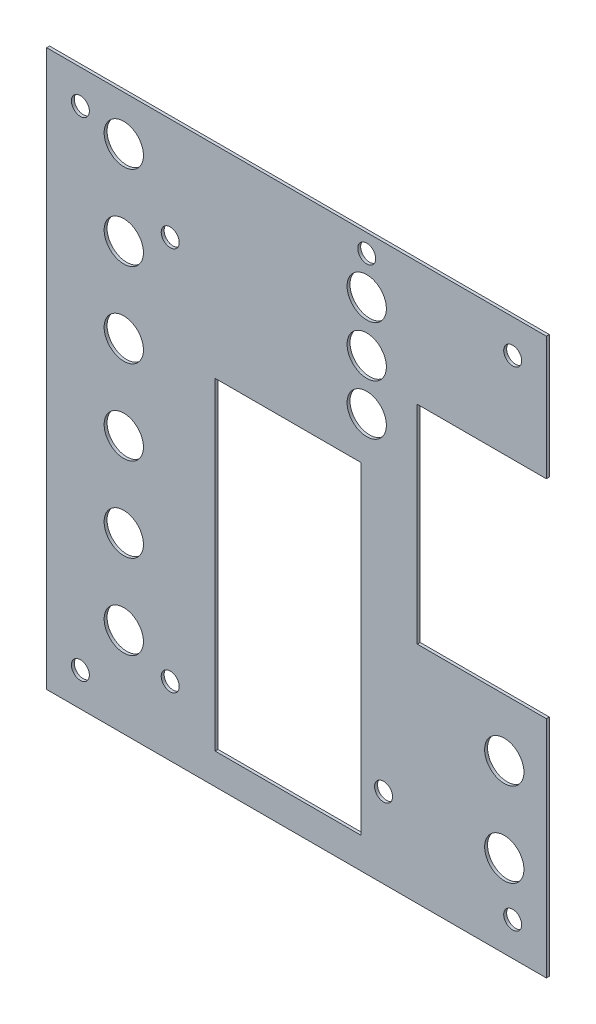
ISO-10303-21;
HEADER;
FILE_DESCRIPTION(('STEP AP214'),'2;1');
FILE_NAME('part.step','',(''),(''),'','','');
FILE_SCHEMA(('AUTOMOTIVE_DESIGN { 1 0 10303 214 1 1 1 1 }'));
ENDSEC;
DATA;
#1=APPLICATION_CONTEXT('core data for automotive mechanical design processes');
#2=APPLICATION_PROTOCOL_DEFINITION('international standard','automotive_design',2000,#1);
#3=PRODUCT_CONTEXT('',#1,'mechanical');
#4=PRODUCT('Part','Part','',(#3));
#5=PRODUCT_RELATED_PRODUCT_CATEGORY('part','',(#4));
#6=PRODUCT_DEFINITION_FORMATION('','',#4);
#7=PRODUCT_DEFINITION_CONTEXT('part definition',#1,'design');
#8=PRODUCT_DEFINITION('design','',#6,#7);
#9=PRODUCT_DEFINITION_SHAPE('','',#8);
#10=(LENGTH_UNIT() NAMED_UNIT(*) SI_UNIT(.MILLI.,.METRE.));
#11=(NAMED_UNIT(*) PLANE_ANGLE_UNIT() SI_UNIT($,.RADIAN.));
#12=(NAMED_UNIT(*) SI_UNIT($,.STERADIAN.) SOLID_ANGLE_UNIT());
#13=UNCERTAINTY_MEASURE_WITH_UNIT(LENGTH_MEASURE(1.E-05),#10,'distance_accuracy_value','');
#14=(GEOMETRIC_REPRESENTATION_CONTEXT(3) GLOBAL_UNCERTAINTY_ASSIGNED_CONTEXT((#13)) GLOBAL_UNIT_ASSIGNED_CONTEXT((#10,
#11,#12)) REPRESENTATION_CONTEXT('',''));
#15=CARTESIAN_POINT('',(0.,0.,0.));
#16=DIRECTION('',(0.,0.,1.));
#17=DIRECTION('',(1.,0.,0.));
#18=AXIS2_PLACEMENT_3D('',#15,#16,#17);
#19=CARTESIAN_POINT('',(0.,0.,0.));
#20=DIRECTION('',(0.,0.,1.));
#21=DIRECTION('',(1.,0.,0.));
#22=AXIS2_PLACEMENT_3D('',#19,#20,#21);
#23=PLANE('',#22);
#24=CARTESIAN_POINT('',(6.,93.,0.));
#25=DIRECTION('',(0.,0.,1.));
#26=DIRECTION('',(1.,0.,0.));
#27=AXIS2_PLACEMENT_3D('',#24,#25,#26);
#28=CIRCLE('',#27,1.6);
#29=CARTESIAN_POINT('',(7.6,93.,0.));
#30=VERTEX_POINT('',#29);
#31=EDGE_CURVE('E26',#30,#30,#28,.T.);
#32=ORIENTED_EDGE('',*,*,#31,.F.);
#33=EDGE_LOOP('',(#32));
#34=FACE_BOUND('',#33,.T.);
#35=CARTESIAN_POINT('',(6.,6.,0.));
#36=DIRECTION('',(0.,0.,1.));
#37=DIRECTION('',(1.,0.,0.));
#38=AXIS2_PLACEMENT_3D('',#35,#36,#37);
#39=CIRCLE('',#38,1.6);
#40=CARTESIAN_POINT('',(7.6,6.,0.));
#41=VERTEX_POINT('',#40);
#42=EDGE_CURVE('E345',#41,#41,#39,.T.);
#43=ORIENTED_EDGE('',*,*,#42,.F.);
#44=EDGE_LOOP('',(#43));
#45=FACE_BOUND('',#44,.T.);
#46=CARTESIAN_POINT('',(83.,6.,0.));
#47=DIRECTION('',(0.,0.,1.));
#48=DIRECTION('',(1.,0.,0.));
#49=AXIS2_PLACEMENT_3D('',#46,#47,#48);
#50=CIRCLE('',#49,1.6);
#51=CARTESIAN_POINT('',(84.6,6.,0.));
#52=VERTEX_POINT('',#51);
#53=EDGE_CURVE('E164',#52,#52,#50,.T.);
#54=ORIENTED_EDGE('',*,*,#53,.F.);
#55=EDGE_LOOP('',(#54));
#56=FACE_BOUND('',#55,.T.);
#57=CARTESIAN_POINT('',(60.,14.25,0.));
#58=DIRECTION('',(0.,0.,1.));
#59=DIRECTION('',(1.,0.,0.));
#60=AXIS2_PLACEMENT_3D('',#57,#58,#59);
#61=CIRCLE('',#60,1.6);
#62=CARTESIAN_POINT('',(61.6,14.25,0.));
#63=VERTEX_POINT('',#62);
#64=EDGE_CURVE('E201',#63,#63,#61,.T.);
#65=ORIENTED_EDGE('',*,*,#64,.F.);
#66=EDGE_LOOP('',(#65));
#67=FACE_BOUND('',#66,.T.);
#68=CARTESIAN_POINT('',(57.,71.,0.));
#69=DIRECTION('',(0.,0.,1.));
#70=DIRECTION('',(1.,0.,0.));
#71=AXIS2_PLACEMENT_3D('',#68,#69,#70);
#72=CIRCLE('',#71,3.5);
#73=CARTESIAN_POINT('',(60.5,71.,0.));
#74=VERTEX_POINT('',#73);
#75=EDGE_CURVE('E300',#74,#74,#72,.T.);
#76=ORIENTED_EDGE('',*,*,#75,.F.);
#77=EDGE_LOOP('',(#76));
#78=FACE_BOUND('',#77,.T.);
#79=CARTESIAN_POINT('',(57.,95.75,0.));
#80=DIRECTION('',(0.,0.,1.));
#81=DIRECTION('',(1.,0.,0.));
#82=AXIS2_PLACEMENT_3D('',#79,#80,#81);
#83=CIRCLE('',#82,1.6);
#84=CARTESIAN_POINT('',(58.6,95.75,0.));
#85=VERTEX_POINT('',#84);
#86=EDGE_CURVE('E254',#85,#85,#83,.T.);
#87=ORIENTED_EDGE('',*,*,#86,.F.);
#88=EDGE_LOOP('',(#87));
#89=FACE_BOUND('',#88,.T.);
#90=CARTESIAN_POINT('',(83.,93.,0.));
#91=DIRECTION('',(0.,0.,1.));
#92=DIRECTION('',(1.,0.,0.));
#93=AXIS2_PLACEMENT_3D('',#90,#91,#92);
#94=CIRCLE('',#93,1.6);
#95=CARTESIAN_POINT('',(84.6,93.,0.));
#96=VERTEX_POINT('',#95);
#97=EDGE_CURVE('E287',#96,#96,#94,.T.);
#98=ORIENTED_EDGE('',*,*,#97,.F.);
#99=EDGE_LOOP('',(#98));
#100=FACE_BOUND('',#99,.T.);
#101=CARTESIAN_POINT('',(81.5,29.75,0.));
#102=DIRECTION('',(0.,0.,1.));
#103=DIRECTION('',(1.,0.,0.));
#104=AXIS2_PLACEMENT_3D('',#101,#102,#103);
#105=CIRCLE('',#104,3.5);
#106=CARTESIAN_POINT('',(85.,29.75,0.));
#107=VERTEX_POINT('',#106);
#108=EDGE_CURVE('E275',#107,#107,#105,.T.);
#109=ORIENTED_EDGE('',*,*,#108,.F.);
#110=EDGE_LOOP('',(#109));
#111=FACE_BOUND('',#110,.T.);
#112=CARTESIAN_POINT('',(81.5,14.75,0.));
#113=DIRECTION('',(0.,0.,1.));
#114=DIRECTION('',(1.,0.,0.));
#115=AXIS2_PLACEMENT_3D('',#112,#113,#114);
#116=CIRCLE('',#115,3.5);
#117=CARTESIAN_POINT('',(85.,14.75,0.));
#118=VERTEX_POINT('',#117);
#119=EDGE_CURVE('E399',#118,#118,#116,.T.);
#120=ORIENTED_EDGE('',*,*,#119,.F.);
#121=EDGE_LOOP('',(#120));
#122=FACE_BOUND('',#121,.T.);
#123=CARTESIAN_POINT('',(13.73,91.,0.));
#124=DIRECTION('',(0.,0.,1.));
#125=DIRECTION('',(1.,0.,0.));
#126=AXIS2_PLACEMENT_3D('',#123,#124,#125);
#127=CIRCLE('',#126,3.5);
#128=CARTESIAN_POINT('',(17.23,91.,0.));
#129=VERTEX_POINT('',#128);
#130=EDGE_CURVE('E185',#129,#129,#127,.T.);
#131=ORIENTED_EDGE('',*,*,#130,.F.);
#132=EDGE_LOOP('',(#131));
#133=FACE_BOUND('',#132,.T.);
#134=CARTESIAN_POINT('',(22.,80.75,0.));
#135=DIRECTION('',(0.,0.,1.));
#136=DIRECTION('',(1.,0.,0.));
#137=AXIS2_PLACEMENT_3D('',#134,#135,#136);
#138=CIRCLE('',#137,1.6);
#139=CARTESIAN_POINT('',(23.6,80.75,0.));
#140=VERTEX_POINT('',#139);
#141=EDGE_CURVE('E266',#140,#140,#138,.T.);
#142=ORIENTED_EDGE('',*,*,#141,.F.);
#143=EDGE_LOOP('',(#142));
#144=FACE_BOUND('',#143,.T.);
#145=CARTESIAN_POINT('',(13.73,76.,0.));
#146=DIRECTION('',(0.,0.,1.));
#147=DIRECTION('',(1.,0.,0.));
#148=AXIS2_PLACEMENT_3D('',#145,#146,#147);
#149=CIRCLE('',#148,3.5);
#150=CARTESIAN_POINT('',(17.23,76.,0.));
#151=VERTEX_POINT('',#150);
#152=EDGE_CURVE('E317',#151,#151,#149,.T.);
#153=ORIENTED_EDGE('',*,*,#152,.F.);
#154=EDGE_LOOP('',(#153));
#155=FACE_BOUND('',#154,.T.);
#156=CARTESIAN_POINT('',(57.,80.,0.));
#157=DIRECTION('',(0.,0.,1.));
#158=DIRECTION('',(1.,0.,0.));
#159=AXIS2_PLACEMENT_3D('',#156,#157,#158);
#160=CIRCLE('',#159,3.5);
#161=CARTESIAN_POINT('',(60.5,80.,0.));
#162=VERTEX_POINT('',#161);
#163=EDGE_CURVE('E210',#162,#162,#160,.T.);
#164=ORIENTED_EDGE('',*,*,#163,.F.);
#165=EDGE_LOOP('',(#164));
#166=FACE_BOUND('',#165,.T.);
#167=CARTESIAN_POINT('',(57.,89.,0.));
#168=DIRECTION('',(0.,0.,1.));
#169=DIRECTION('',(1.,0.,0.));
#170=AXIS2_PLACEMENT_3D('',#167,#168,#169);
#171=CIRCLE('',#170,3.5);
#172=CARTESIAN_POINT('',(60.5,89.,0.));
#173=VERTEX_POINT('',#172);
#174=EDGE_CURVE('E255',#173,#173,#171,.T.);
#175=ORIENTED_EDGE('',*,*,#174,.F.);
#176=EDGE_LOOP('',(#175));
#177=FACE_BOUND('',#176,.T.);
#178=DIRECTION('',(0.,1.,0.));
#179=VECTOR('',#178,1.);
#180=CARTESIAN_POINT('',(30.,5.5,0.));
#181=LINE('',#180,#179);
#182=CARTESIAN_POINT('',(30.,5.5,0.));
#183=VERTEX_POINT('',#182);
#184=CARTESIAN_POINT('',(30.,63.,0.));
#185=VERTEX_POINT('',#184);
#186=EDGE_CURVE('E448',#183,#185,#181,.T.);
#187=ORIENTED_EDGE('',*,*,#186,.T.);
#188=DIRECTION('',(1.,0.,0.));
#189=VECTOR('',#188,1.);
#190=CARTESIAN_POINT('',(30.,63.,0.));
#191=LINE('',#190,#189);
#192=CARTESIAN_POINT('',(56.,63.,0.));
#193=VERTEX_POINT('',#192);
#194=EDGE_CURVE('E425',#185,#193,#191,.T.);
#195=ORIENTED_EDGE('',*,*,#194,.T.);
#196=DIRECTION('',(0.,-1.,0.));
#197=VECTOR('',#196,1.);
#198=CARTESIAN_POINT('',(56.,63.,0.));
#199=LINE('',#198,#197);
#200=CARTESIAN_POINT('',(56.,5.5,0.));
#201=VERTEX_POINT('',#200);
#202=EDGE_CURVE('E368',#193,#201,#199,.T.);
#203=ORIENTED_EDGE('',*,*,#202,.T.);
#204=DIRECTION('',(-1.,0.,0.));
#205=VECTOR('',#204,1.);
#206=CARTESIAN_POINT('',(56.,5.5,0.));
#207=LINE('',#206,#205);
#208=EDGE_CURVE('E265',#201,#183,#207,.T.);
#209=ORIENTED_EDGE('',*,*,#208,.T.);
#210=EDGE_LOOP('',(#187,#195,#203,#209));
#211=FACE_BOUND('',#210,.T.);
#212=CARTESIAN_POINT('',(13.73,46.,0.));
#213=DIRECTION('',(0.,0.,1.));
#214=DIRECTION('',(1.,0.,0.));
#215=AXIS2_PLACEMENT_3D('',#212,#213,#214);
#216=CIRCLE('',#215,3.5);
#217=CARTESIAN_POINT('',(17.23,46.,0.));
#218=VERTEX_POINT('',#217);
#219=EDGE_CURVE('E324',#218,#218,#216,.T.);
#220=ORIENTED_EDGE('',*,*,#219,.F.);
#221=EDGE_LOOP('',(#220));
#222=FACE_BOUND('',#221,.T.);
#223=CARTESIAN_POINT('',(13.73,61.,0.));
#224=DIRECTION('',(0.,0.,1.));
#225=DIRECTION('',(1.,0.,0.));
#226=AXIS2_PLACEMENT_3D('',#223,#224,#225);
#227=CIRCLE('',#226,3.5);
#228=CARTESIAN_POINT('',(17.23,61.,0.));
#229=VERTEX_POINT('',#228);
#230=EDGE_CURVE('E387',#229,#229,#227,.T.);
#231=ORIENTED_EDGE('',*,*,#230,.F.);
#232=EDGE_LOOP('',(#231));
#233=FACE_BOUND('',#232,.T.);
#234=CARTESIAN_POINT('',(22.,12.25,0.));
#235=DIRECTION('',(0.,0.,1.));
#236=DIRECTION('',(1.,0.,0.));
#237=AXIS2_PLACEMENT_3D('',#234,#235,#236);
#238=CIRCLE('',#237,1.6);
#239=CARTESIAN_POINT('',(23.6,12.25,0.));
#240=VERTEX_POINT('',#239);
#241=EDGE_CURVE('E288',#240,#240,#238,.T.);
#242=ORIENTED_EDGE('',*,*,#241,.F.);
#243=EDGE_LOOP('',(#242));
#244=FACE_BOUND('',#243,.T.);
#245=CARTESIAN_POINT('',(13.73,31.,0.));
#246=DIRECTION('',(0.,0.,1.));
#247=DIRECTION('',(1.,0.,0.));
#248=AXIS2_PLACEMENT_3D('',#245,#246,#247);
#249=CIRCLE('',#248,3.5);
#250=CARTESIAN_POINT('',(17.23,31.,0.));
#251=VERTEX_POINT('',#250);
#252=EDGE_CURVE('E209',#251,#251,#249,.T.);
#253=ORIENTED_EDGE('',*,*,#252,.F.);
#254=EDGE_LOOP('',(#253));
#255=FACE_BOUND('',#254,.T.);
#256=CARTESIAN_POINT('',(13.73,16.,0.));
#257=DIRECTION('',(0.,0.,1.));
#258=DIRECTION('',(1.,0.,0.));
#259=AXIS2_PLACEMENT_3D('',#256,#257,#258);
#260=CIRCLE('',#259,3.5);
#261=CARTESIAN_POINT('',(17.23,16.,0.));
#262=VERTEX_POINT('',#261);
#263=EDGE_CURVE('E301',#262,#262,#260,.T.);
#264=ORIENTED_EDGE('',*,*,#263,.F.);
#265=EDGE_LOOP('',(#264));
#266=FACE_BOUND('',#265,.T.);
#267=DIRECTION('',(0.,1.,0.));
#268=VECTOR('',#267,1.);
#269=CARTESIAN_POINT('',(0.,0.,0.));
#270=LINE('',#269,#268);
#271=CARTESIAN_POINT('',(0.,0.,0.));
#272=VERTEX_POINT('',#271);
#273=CARTESIAN_POINT('',(0.,99.,0.));
#274=VERTEX_POINT('',#273);
#275=EDGE_CURVE('E194',#272,#274,#270,.T.);
#276=ORIENTED_EDGE('',*,*,#275,.F.);
#277=DIRECTION('',(-1.,0.,0.));
#278=VECTOR('',#277,1.);
#279=CARTESIAN_POINT('',(89.,0.,0.));
#280=LINE('',#279,#278);
#281=CARTESIAN_POINT('',(89.,0.,0.));
#282=VERTEX_POINT('',#281);
#283=EDGE_CURVE('E195',#282,#272,#280,.T.);
#284=ORIENTED_EDGE('',*,*,#283,.F.);
#285=DIRECTION('',(0.,-1.,0.));
#286=VECTOR('',#285,1.);
#287=CARTESIAN_POINT('',(89.,99.,0.));
#288=LINE('',#287,#286);
#289=CARTESIAN_POINT('',(89.,40.,0.));
#290=VERTEX_POINT('',#289);
#291=EDGE_CURVE('E233',#290,#282,#288,.T.);
#292=ORIENTED_EDGE('',*,*,#291,.F.);
#293=DIRECTION('',(1.,0.,0.));
#294=VECTOR('',#293,1.);
#295=CARTESIAN_POINT('',(66.,40.,0.));
#296=LINE('',#295,#294);
#297=CARTESIAN_POINT('',(66.,40.,0.));
#298=VERTEX_POINT('',#297);
#299=EDGE_CURVE('E221',#298,#290,#296,.T.);
#300=ORIENTED_EDGE('',*,*,#299,.F.);
#301=DIRECTION('',(0.,-1.,0.));
#302=VECTOR('',#301,1.);
#303=CARTESIAN_POINT('',(66.,77.,0.));
#304=LINE('',#303,#302);
#305=CARTESIAN_POINT('',(66.,77.,0.));
#306=VERTEX_POINT('',#305);
#307=EDGE_CURVE('E19',#306,#298,#304,.T.);
#308=ORIENTED_EDGE('',*,*,#307,.F.);
#309=DIRECTION('',(-1.,0.,0.));
#310=VECTOR('',#309,1.);
#311=CARTESIAN_POINT('',(89.5,77.,0.));
#312=LINE('',#311,#310);
#313=CARTESIAN_POINT('',(89.,77.,0.));
#314=VERTEX_POINT('',#313);
#315=EDGE_CURVE('E318',#314,#306,#312,.T.);
#316=ORIENTED_EDGE('',*,*,#315,.F.);
#317=DIRECTION('',(0.,-1.,0.));
#318=VECTOR('',#317,1.);
#319=CARTESIAN_POINT('',(89.,99.,0.));
#320=LINE('',#319,#318);
#321=CARTESIAN_POINT('',(89.,99.,0.));
#322=VERTEX_POINT('',#321);
#323=EDGE_CURVE('E386',#322,#314,#320,.T.);
#324=ORIENTED_EDGE('',*,*,#323,.F.);
#325=DIRECTION('',(1.,0.,0.));
#326=VECTOR('',#325,1.);
#327=CARTESIAN_POINT('',(0.,99.,0.));
#328=LINE('',#327,#326);
#329=EDGE_CURVE('E350',#274,#322,#328,.T.);
#330=ORIENTED_EDGE('',*,*,#329,.F.);
#331=EDGE_LOOP('',(#276,#284,#292,#300,#308,#316,#324,#330));
#332=FACE_BOUND('',#331,.T.);
#333=ADVANCED_FACE('F15',(#34,#45,#56,#67,#78,#89,#100,#111,#122,#133,#144,#155,#166,#177,#211,
#222,#233,#244,#255,#266,#332),#23,.T.);
#334=CARTESIAN_POINT('',(0.,0.,-0.5208016));
#335=DIRECTION('',(0.,0.,1.));
#336=DIRECTION('',(1.,0.,0.));
#337=AXIS2_PLACEMENT_3D('',#334,#335,#336);
#338=PLANE('',#337);
#339=CARTESIAN_POINT('',(6.,93.,-0.5208016));
#340=DIRECTION('',(0.,0.,1.));
#341=DIRECTION('',(1.,0.,0.));
#342=AXIS2_PLACEMENT_3D('',#339,#340,#341);
#343=CIRCLE('',#342,1.6);
#344=CARTESIAN_POINT('',(7.6,93.,-0.5208016));
#345=VERTEX_POINT('',#344);
#346=EDGE_CURVE('E9',#345,#345,#343,.T.);
#347=ORIENTED_EDGE('',*,*,#346,.T.);
#348=EDGE_LOOP('',(#347));
#349=FACE_BOUND('',#348,.T.);
#350=CARTESIAN_POINT('',(6.,6.,-0.5208016));
#351=DIRECTION('',(0.,0.,1.));
#352=DIRECTION('',(1.,0.,0.));
#353=AXIS2_PLACEMENT_3D('',#350,#351,#352);
#354=CIRCLE('',#353,1.6);
#355=CARTESIAN_POINT('',(7.6,6.,-0.5208016));
#356=VERTEX_POINT('',#355);
#357=EDGE_CURVE('E341',#356,#356,#354,.T.);
#358=ORIENTED_EDGE('',*,*,#357,.T.);
#359=EDGE_LOOP('',(#358));
#360=FACE_BOUND('',#359,.T.);
#361=CARTESIAN_POINT('',(83.,6.,-0.5208016));
#362=DIRECTION('',(0.,0.,1.));
#363=DIRECTION('',(1.,0.,0.));
#364=AXIS2_PLACEMENT_3D('',#361,#362,#363);
#365=CIRCLE('',#364,1.6);
#366=CARTESIAN_POINT('',(84.6,6.,-0.5208016));
#367=VERTEX_POINT('',#366);
#368=EDGE_CURVE('E170',#367,#367,#365,.T.);
#369=ORIENTED_EDGE('',*,*,#368,.T.);
#370=EDGE_LOOP('',(#369));
#371=FACE_BOUND('',#370,.T.);
#372=CARTESIAN_POINT('',(60.,14.25,-0.5208016));
#373=DIRECTION('',(0.,0.,1.));
#374=DIRECTION('',(1.,0.,0.));
#375=AXIS2_PLACEMENT_3D('',#372,#373,#374);
#376=CIRCLE('',#375,1.6);
#377=CARTESIAN_POINT('',(61.6,14.25,-0.5208016));
#378=VERTEX_POINT('',#377);
#379=EDGE_CURVE('E179',#378,#378,#376,.T.);
#380=ORIENTED_EDGE('',*,*,#379,.T.);
#381=EDGE_LOOP('',(#380));
#382=FACE_BOUND('',#381,.T.);
#383=CARTESIAN_POINT('',(57.,71.,-0.5208016));
#384=DIRECTION('',(0.,0.,1.));
#385=DIRECTION('',(1.,0.,0.));
#386=AXIS2_PLACEMENT_3D('',#383,#384,#385);
#387=CIRCLE('',#386,3.5);
#388=CARTESIAN_POINT('',(60.5,71.,-0.5208016));
#389=VERTEX_POINT('',#388);
#390=EDGE_CURVE('E334',#389,#389,#387,.T.);
#391=ORIENTED_EDGE('',*,*,#390,.T.);
#392=EDGE_LOOP('',(#391));
#393=FACE_BOUND('',#392,.T.);
#394=CARTESIAN_POINT('',(57.,95.75,-0.5208016));
#395=DIRECTION('',(0.,0.,1.));
#396=DIRECTION('',(1.,0.,0.));
#397=AXIS2_PLACEMENT_3D('',#394,#395,#396);
#398=CIRCLE('',#397,1.6);
#399=CARTESIAN_POINT('',(58.6,95.75,-0.5208016));
#400=VERTEX_POINT('',#399);
#401=EDGE_CURVE('E250',#400,#400,#398,.T.);
#402=ORIENTED_EDGE('',*,*,#401,.T.);
#403=EDGE_LOOP('',(#402));
#404=FACE_BOUND('',#403,.T.);
#405=CARTESIAN_POINT('',(83.,93.,-0.5208016));
#406=DIRECTION('',(0.,0.,1.));
#407=DIRECTION('',(1.,0.,0.));
#408=AXIS2_PLACEMENT_3D('',#405,#406,#407);
#409=CIRCLE('',#408,1.6);
#410=CARTESIAN_POINT('',(84.6,93.,-0.5208016));
#411=VERTEX_POINT('',#410);
#412=EDGE_CURVE('E296',#411,#411,#409,.T.);
#413=ORIENTED_EDGE('',*,*,#412,.T.);
#414=EDGE_LOOP('',(#413));
#415=FACE_BOUND('',#414,.T.);
#416=CARTESIAN_POINT('',(81.5,29.75,-0.5208016));
#417=DIRECTION('',(0.,0.,1.));
#418=DIRECTION('',(1.,0.,0.));
#419=AXIS2_PLACEMENT_3D('',#416,#417,#418);
#420=CIRCLE('',#419,3.5);
#421=CARTESIAN_POINT('',(85.,29.75,-0.5208016));
#422=VERTEX_POINT('',#421);
#423=EDGE_CURVE('E278',#422,#422,#420,.T.);
#424=ORIENTED_EDGE('',*,*,#423,.T.);
#425=EDGE_LOOP('',(#424));
#426=FACE_BOUND('',#425,.T.);
#427=CARTESIAN_POINT('',(81.5,14.75,-0.5208016));
#428=DIRECTION('',(0.,0.,1.));
#429=DIRECTION('',(1.,0.,0.));
#430=AXIS2_PLACEMENT_3D('',#427,#428,#429);
#431=CIRCLE('',#430,3.5);
#432=CARTESIAN_POINT('',(85.,14.75,-0.5208016));
#433=VERTEX_POINT('',#432);
#434=EDGE_CURVE('E402',#433,#433,#431,.T.);
#435=ORIENTED_EDGE('',*,*,#434,.T.);
#436=EDGE_LOOP('',(#435));
#437=FACE_BOUND('',#436,.T.);
#438=CARTESIAN_POINT('',(13.73,91.,-0.5208016));
#439=DIRECTION('',(0.,0.,1.));
#440=DIRECTION('',(1.,0.,0.));
#441=AXIS2_PLACEMENT_3D('',#438,#439,#440);
#442=CIRCLE('',#441,3.5);
#443=CARTESIAN_POINT('',(17.23,91.,-0.5208016));
#444=VERTEX_POINT('',#443);
#445=EDGE_CURVE('E188',#444,#444,#442,.T.);
#446=ORIENTED_EDGE('',*,*,#445,.T.);
#447=EDGE_LOOP('',(#446));
#448=FACE_BOUND('',#447,.T.);
#449=CARTESIAN_POINT('',(22.,80.75,-0.5208016));
#450=DIRECTION('',(0.,0.,1.));
#451=DIRECTION('',(1.,0.,0.));
#452=AXIS2_PLACEMENT_3D('',#449,#450,#451);
#453=CIRCLE('',#452,1.6);
#454=CARTESIAN_POINT('',(23.6,80.75,-0.5208016));
#455=VERTEX_POINT('',#454);
#456=EDGE_CURVE('E269',#455,#455,#453,.T.);
#457=ORIENTED_EDGE('',*,*,#456,.T.);
#458=EDGE_LOOP('',(#457));
#459=FACE_BOUND('',#458,.T.);
#460=CARTESIAN_POINT('',(13.73,76.,-0.5208016));
#461=DIRECTION('',(0.,0.,1.));
#462=DIRECTION('',(1.,0.,0.));
#463=AXIS2_PLACEMENT_3D('',#460,#461,#462);
#464=CIRCLE('',#463,3.5);
#465=CARTESIAN_POINT('',(17.23,76.,-0.5208016));
#466=VERTEX_POINT('',#465);
#467=EDGE_CURVE('E391',#466,#466,#464,.T.);
#468=ORIENTED_EDGE('',*,*,#467,.T.);
#469=EDGE_LOOP('',(#468));
#470=FACE_BOUND('',#469,.T.);
#471=CARTESIAN_POINT('',(57.,80.,-0.5208016));
#472=DIRECTION('',(0.,0.,1.));
#473=DIRECTION('',(1.,0.,0.));
#474=AXIS2_PLACEMENT_3D('',#471,#472,#473);
#475=CIRCLE('',#474,3.5);
#476=CARTESIAN_POINT('',(60.5,80.,-0.5208016));
#477=VERTEX_POINT('',#476);
#478=EDGE_CURVE('E213',#477,#477,#475,.T.);
#479=ORIENTED_EDGE('',*,*,#478,.T.);
#480=EDGE_LOOP('',(#479));
#481=FACE_BOUND('',#480,.T.);
#482=CARTESIAN_POINT('',(57.,89.,-0.5208016));
#483=DIRECTION('',(0.,0.,1.));
#484=DIRECTION('',(1.,0.,0.));
#485=AXIS2_PLACEMENT_3D('',#482,#483,#484);
#486=CIRCLE('',#485,3.5);
#487=CARTESIAN_POINT('',(60.5,89.,-0.5208016));
#488=VERTEX_POINT('',#487);
#489=EDGE_CURVE('E257',#488,#488,#486,.T.);
#490=ORIENTED_EDGE('',*,*,#489,.T.);
#491=EDGE_LOOP('',(#490));
#492=FACE_BOUND('',#491,.T.);
#493=DIRECTION('',(-1.,0.,0.));
#494=VECTOR('',#493,1.);
#495=CARTESIAN_POINT('',(56.,5.5,-0.5208016));
#496=LINE('',#495,#494);
#497=CARTESIAN_POINT('',(56.,5.5,-0.5208016));
#498=VERTEX_POINT('',#497);
#499=CARTESIAN_POINT('',(30.,5.5,-0.5208016));
#500=VERTEX_POINT('',#499);
#501=EDGE_CURVE('E282',#498,#500,#496,.T.);
#502=ORIENTED_EDGE('',*,*,#501,.F.);
#503=DIRECTION('',(0.,-1.,0.));
#504=VECTOR('',#503,1.);
#505=CARTESIAN_POINT('',(56.,63.,-0.5208016));
#506=LINE('',#505,#504);
#507=CARTESIAN_POINT('',(56.,63.,-0.5208016));
#508=VERTEX_POINT('',#507);
#509=EDGE_CURVE('E372',#508,#498,#506,.T.);
#510=ORIENTED_EDGE('',*,*,#509,.F.);
#511=DIRECTION('',(1.,0.,0.));
#512=VECTOR('',#511,1.);
#513=CARTESIAN_POINT('',(30.,63.,-0.5208016));
#514=LINE('',#513,#512);
#515=CARTESIAN_POINT('',(30.,63.,-0.5208016));
#516=VERTEX_POINT('',#515);
#517=EDGE_CURVE('E264',#516,#508,#514,.T.);
#518=ORIENTED_EDGE('',*,*,#517,.F.);
#519=DIRECTION('',(0.,1.,0.));
#520=VECTOR('',#519,1.);
#521=CARTESIAN_POINT('',(30.,5.5,-0.5208016));
#522=LINE('',#521,#520);
#523=EDGE_CURVE('E420',#500,#516,#522,.T.);
#524=ORIENTED_EDGE('',*,*,#523,.F.);
#525=EDGE_LOOP('',(#502,#510,#518,#524));
#526=FACE_BOUND('',#525,.T.);
#527=CARTESIAN_POINT('',(13.73,46.,-0.5208016));
#528=DIRECTION('',(0.,0.,1.));
#529=DIRECTION('',(1.,0.,0.));
#530=AXIS2_PLACEMENT_3D('',#527,#528,#529);
#531=CIRCLE('',#530,3.5);
#532=CARTESIAN_POINT('',(17.23,46.,-0.5208016));
#533=VERTEX_POINT('',#532);
#534=EDGE_CURVE('E328',#533,#533,#531,.T.);
#535=ORIENTED_EDGE('',*,*,#534,.T.);
#536=EDGE_LOOP('',(#535));
#537=FACE_BOUND('',#536,.T.);
#538=CARTESIAN_POINT('',(13.73,61.,-0.5208016));
#539=DIRECTION('',(0.,0.,1.));
#540=DIRECTION('',(1.,0.,0.));
#541=AXIS2_PLACEMENT_3D('',#538,#539,#540);
#542=CIRCLE('',#541,3.5);
#543=CARTESIAN_POINT('',(17.23,61.,-0.5208016));
#544=VERTEX_POINT('',#543);
#545=EDGE_CURVE('E183',#544,#544,#542,.T.);
#546=ORIENTED_EDGE('',*,*,#545,.T.);
#547=EDGE_LOOP('',(#546));
#548=FACE_BOUND('',#547,.T.);
#549=CARTESIAN_POINT('',(22.,12.25,-0.5208016));
#550=DIRECTION('',(0.,0.,1.));
#551=DIRECTION('',(1.,0.,0.));
#552=AXIS2_PLACEMENT_3D('',#549,#550,#551);
#553=CIRCLE('',#552,1.6);
#554=CARTESIAN_POINT('',(23.6,12.25,-0.5208016));
#555=VERTEX_POINT('',#554);
#556=EDGE_CURVE('E292',#555,#555,#553,.T.);
#557=ORIENTED_EDGE('',*,*,#556,.T.);
#558=EDGE_LOOP('',(#557));
#559=FACE_BOUND('',#558,.T.);
#560=CARTESIAN_POINT('',(13.73,31.,-0.5208016));
#561=DIRECTION('',(0.,0.,1.));
#562=DIRECTION('',(1.,0.,0.));
#563=AXIS2_PLACEMENT_3D('',#560,#561,#562);
#564=CIRCLE('',#563,3.5);
#565=CARTESIAN_POINT('',(17.23,31.,-0.5208016));
#566=VERTEX_POINT('',#565);
#567=EDGE_CURVE('E205',#566,#566,#564,.T.);
#568=ORIENTED_EDGE('',*,*,#567,.T.);
#569=EDGE_LOOP('',(#568));
#570=FACE_BOUND('',#569,.T.);
#571=CARTESIAN_POINT('',(13.73,16.,-0.5208016));
#572=DIRECTION('',(0.,0.,1.));
#573=DIRECTION('',(1.,0.,0.));
#574=AXIS2_PLACEMENT_3D('',#571,#572,#573);
#575=CIRCLE('',#574,3.5);
#576=CARTESIAN_POINT('',(17.23,16.,-0.5208016));
#577=VERTEX_POINT('',#576);
#578=EDGE_CURVE('E305',#577,#577,#575,.T.);
#579=ORIENTED_EDGE('',*,*,#578,.T.);
#580=EDGE_LOOP('',(#579));
#581=FACE_BOUND('',#580,.T.);
#582=DIRECTION('',(1.,0.,0.));
#583=VECTOR('',#582,1.);
#584=CARTESIAN_POINT('',(0.,99.,-0.5208016));
#585=LINE('',#584,#583);
#586=CARTESIAN_POINT('',(0.,99.,-0.5208016));
#587=VERTEX_POINT('',#586);
#588=CARTESIAN_POINT('',(89.,99.,-0.5208016));
#589=VERTEX_POINT('',#588);
#590=EDGE_CURVE('E358',#587,#589,#585,.T.);
#591=ORIENTED_EDGE('',*,*,#590,.T.);
#592=DIRECTION('',(0.,-1.,0.));
#593=VECTOR('',#592,1.);
#594=CARTESIAN_POINT('',(89.,99.,-0.5208016));
#595=LINE('',#594,#593);
#596=CARTESIAN_POINT('',(89.,77.,-0.5208016));
#597=VERTEX_POINT('',#596);
#598=EDGE_CURVE('E323',#589,#597,#595,.T.);
#599=ORIENTED_EDGE('',*,*,#598,.T.);
#600=DIRECTION('',(-1.,0.,0.));
#601=VECTOR('',#600,1.);
#602=CARTESIAN_POINT('',(89.5,77.,-0.5208016));
#603=LINE('',#602,#601);
#604=CARTESIAN_POINT('',(66.,77.,-0.5208016));
#605=VERTEX_POINT('',#604);
#606=EDGE_CURVE('E430',#597,#605,#603,.T.);
#607=ORIENTED_EDGE('',*,*,#606,.T.);
#608=DIRECTION('',(0.,-1.,0.));
#609=VECTOR('',#608,1.);
#610=CARTESIAN_POINT('',(66.,77.,-0.5208016));
#611=LINE('',#610,#609);
#612=CARTESIAN_POINT('',(66.,40.,-0.5208016));
#613=VERTEX_POINT('',#612);
#614=EDGE_CURVE('E235',#605,#613,#611,.T.);
#615=ORIENTED_EDGE('',*,*,#614,.T.);
#616=DIRECTION('',(1.,0.,0.));
#617=VECTOR('',#616,1.);
#618=CARTESIAN_POINT('',(66.,40.,-0.5208016));
#619=LINE('',#618,#617);
#620=CARTESIAN_POINT('',(89.,40.,-0.5208016));
#621=VERTEX_POINT('',#620);
#622=EDGE_CURVE('E220',#613,#621,#619,.T.);
#623=ORIENTED_EDGE('',*,*,#622,.T.);
#624=DIRECTION('',(0.,-1.,0.));
#625=VECTOR('',#624,1.);
#626=CARTESIAN_POINT('',(89.,99.,-0.5208016));
#627=LINE('',#626,#625);
#628=CARTESIAN_POINT('',(89.,0.,-0.5208016));
#629=VERTEX_POINT('',#628);
#630=EDGE_CURVE('E200',#621,#629,#627,.T.);
#631=ORIENTED_EDGE('',*,*,#630,.T.);
#632=DIRECTION('',(-1.,0.,0.));
#633=VECTOR('',#632,1.);
#634=CARTESIAN_POINT('',(89.,0.,-0.5208016));
#635=LINE('',#634,#633);
#636=CARTESIAN_POINT('',(0.,0.,-0.5208016));
#637=VERTEX_POINT('',#636);
#638=EDGE_CURVE('E199',#629,#637,#635,.T.);
#639=ORIENTED_EDGE('',*,*,#638,.T.);
#640=DIRECTION('',(0.,1.,0.));
#641=VECTOR('',#640,1.);
#642=CARTESIAN_POINT('',(0.,0.,-0.5208016));
#643=LINE('',#642,#641);
#644=EDGE_CURVE('E346',#637,#587,#643,.T.);
#645=ORIENTED_EDGE('',*,*,#644,.T.);
#646=EDGE_LOOP('',(#591,#599,#607,#615,#623,#631,#639,#645));
#647=FACE_BOUND('',#646,.T.);
#648=ADVANCED_FACE('F644',(#349,#360,#371,#382,#393,#404,#415,#426,#437,#448,#459,#470,#481,
#492,#526,#537,#548,#559,#570,#581,#647),#338,.F.);
#649=CARTESIAN_POINT('',(6.,93.,-0.5208016));
#650=DIRECTION('',(0.,0.,-1.));
#651=DIRECTION('',(1.,0.,0.));
#652=AXIS2_PLACEMENT_3D('',#649,#650,#651);
#653=CYLINDRICAL_SURFACE('',#652,1.6);
#654=DIRECTION('',(0.,0.,1.));
#655=VECTOR('',#654,1.);
#656=CARTESIAN_POINT('',(7.6,93.,-0.5208016));
#657=LINE('',#656,#655);
#658=EDGE_CURVE('E344',#345,#30,#657,.T.);
#659=ORIENTED_EDGE('',*,*,#658,.T.);
#660=ORIENTED_EDGE('',*,*,#31,.T.);
#661=ORIENTED_EDGE('',*,*,#658,.F.);
#662=ORIENTED_EDGE('',*,*,#346,.F.);
#663=EDGE_LOOP('',(#659,#660,#661,#662));
#664=FACE_BOUND('',#663,.T.);
#665=ADVANCED_FACE('F638',(#664),#653,.F.);
#666=CARTESIAN_POINT('',(6.,6.,-0.5208016));
#667=DIRECTION('',(0.,0.,-1.));
#668=DIRECTION('',(1.,0.,0.));
#669=AXIS2_PLACEMENT_3D('',#666,#667,#668);
#670=CYLINDRICAL_SURFACE('',#669,1.6);
#671=DIRECTION('',(0.,0.,1.));
#672=VECTOR('',#671,1.);
#673=CARTESIAN_POINT('',(7.6,6.,-0.5208016));
#674=LINE('',#673,#672);
#675=EDGE_CURVE('E177',#356,#41,#674,.T.);
#676=ORIENTED_EDGE('',*,*,#675,.T.);
#677=ORIENTED_EDGE('',*,*,#42,.T.);
#678=ORIENTED_EDGE('',*,*,#675,.F.);
#679=ORIENTED_EDGE('',*,*,#357,.F.);
#680=EDGE_LOOP('',(#676,#677,#678,#679));
#681=FACE_BOUND('',#680,.T.);
#682=ADVANCED_FACE('F643',(#681),#670,.F.);
#683=CARTESIAN_POINT('',(83.,6.,-0.5208016));
#684=DIRECTION('',(0.,0.,-1.));
#685=DIRECTION('',(1.,0.,0.));
#686=AXIS2_PLACEMENT_3D('',#683,#684,#685);
#687=CYLINDRICAL_SURFACE('',#686,1.6);
#688=DIRECTION('',(0.,0.,1.));
#689=VECTOR('',#688,1.);
#690=CARTESIAN_POINT('',(84.6,6.,-0.5208016));
#691=LINE('',#690,#689);
#692=EDGE_CURVE('E167',#367,#52,#691,.T.);
#693=ORIENTED_EDGE('',*,*,#692,.T.);
#694=ORIENTED_EDGE('',*,*,#53,.T.);
#695=ORIENTED_EDGE('',*,*,#692,.F.);
#696=ORIENTED_EDGE('',*,*,#368,.F.);
#697=EDGE_LOOP('',(#693,#694,#695,#696));
#698=FACE_BOUND('',#697,.T.);
#699=ADVANCED_FACE('F165',(#698),#687,.F.);
#700=CARTESIAN_POINT('',(60.,14.25,-0.5208016));
#701=DIRECTION('',(0.,0.,-1.));
#702=DIRECTION('',(1.,0.,0.));
#703=AXIS2_PLACEMENT_3D('',#700,#701,#702);
#704=CYLINDRICAL_SURFACE('',#703,1.6);
#705=DIRECTION('',(0.,0.,1.));
#706=VECTOR('',#705,1.);
#707=CARTESIAN_POINT('',(61.6,14.25,-0.5208016));
#708=LINE('',#707,#706);
#709=EDGE_CURVE('E204',#378,#63,#708,.T.);
#710=ORIENTED_EDGE('',*,*,#709,.T.);
#711=ORIENTED_EDGE('',*,*,#64,.T.);
#712=ORIENTED_EDGE('',*,*,#709,.F.);
#713=ORIENTED_EDGE('',*,*,#379,.F.);
#714=EDGE_LOOP('',(#710,#711,#712,#713));
#715=FACE_BOUND('',#714,.T.);
#716=ADVANCED_FACE('F666',(#715),#704,.F.);
#717=CARTESIAN_POINT('',(57.,71.,-0.5208016));
#718=DIRECTION('',(0.,0.,-1.));
#719=DIRECTION('',(1.,0.,0.));
#720=AXIS2_PLACEMENT_3D('',#717,#718,#719);
#721=CYLINDRICAL_SURFACE('',#720,3.5);
#722=DIRECTION('',(0.,0.,1.));
#723=VECTOR('',#722,1.);
#724=CARTESIAN_POINT('',(60.5,71.,-0.5208016));
#725=LINE('',#724,#723);
#726=EDGE_CURVE('E253',#389,#74,#725,.T.);
#727=ORIENTED_EDGE('',*,*,#726,.T.);
#728=ORIENTED_EDGE('',*,*,#75,.T.);
#729=ORIENTED_EDGE('',*,*,#726,.F.);
#730=ORIENTED_EDGE('',*,*,#390,.F.);
#731=EDGE_LOOP('',(#727,#728,#729,#730));
#732=FACE_BOUND('',#731,.T.);
#733=ADVANCED_FACE('F629',(#732),#721,.F.);
#734=CARTESIAN_POINT('',(57.,95.75,-0.5208016));
#735=DIRECTION('',(0.,0.,-1.));
#736=DIRECTION('',(1.,0.,0.));
#737=AXIS2_PLACEMENT_3D('',#734,#735,#736);
#738=CYLINDRICAL_SURFACE('',#737,1.6);
#739=DIRECTION('',(0.,0.,1.));
#740=VECTOR('',#739,1.);
#741=CARTESIAN_POINT('',(58.6,95.75,-0.5208016));
#742=LINE('',#741,#740);
#743=EDGE_CURVE('E333',#400,#85,#742,.T.);
#744=ORIENTED_EDGE('',*,*,#743,.T.);
#745=ORIENTED_EDGE('',*,*,#86,.T.);
#746=ORIENTED_EDGE('',*,*,#743,.F.);
#747=ORIENTED_EDGE('',*,*,#401,.F.);
#748=EDGE_LOOP('',(#744,#745,#746,#747));
#749=FACE_BOUND('',#748,.T.);
#750=ADVANCED_FACE('F623',(#749),#738,.F.);
#751=CARTESIAN_POINT('',(83.,93.,-0.5208016));
#752=DIRECTION('',(0.,0.,-1.));
#753=DIRECTION('',(1.,0.,0.));
#754=AXIS2_PLACEMENT_3D('',#751,#752,#753);
#755=CYLINDRICAL_SURFACE('',#754,1.6);
#756=DIRECTION('',(0.,0.,1.));
#757=VECTOR('',#756,1.);
#758=CARTESIAN_POINT('',(84.6,93.,-0.5208016));
#759=LINE('',#758,#757);
#760=EDGE_CURVE('E283',#411,#96,#759,.T.);
#761=ORIENTED_EDGE('',*,*,#760,.T.);
#762=ORIENTED_EDGE('',*,*,#97,.T.);
#763=ORIENTED_EDGE('',*,*,#760,.F.);
#764=ORIENTED_EDGE('',*,*,#412,.F.);
#765=EDGE_LOOP('',(#761,#762,#763,#764));
#766=FACE_BOUND('',#765,.T.);
#767=ADVANCED_FACE('F628',(#766),#755,.F.);
#768=CARTESIAN_POINT('',(81.5,29.75,-0.5208016));
#769=DIRECTION('',(0.,0.,-1.));
#770=DIRECTION('',(1.,0.,0.));
#771=AXIS2_PLACEMENT_3D('',#768,#769,#770);
#772=CYLINDRICAL_SURFACE('',#771,3.5);
#773=DIRECTION('',(0.,0.,1.));
#774=VECTOR('',#773,1.);
#775=CARTESIAN_POINT('',(85.,29.75,-0.5208016));
#776=LINE('',#775,#774);
#777=EDGE_CURVE('E248',#422,#107,#776,.T.);
#778=ORIENTED_EDGE('',*,*,#777,.T.);
#779=ORIENTED_EDGE('',*,*,#108,.T.);
#780=ORIENTED_EDGE('',*,*,#777,.F.);
#781=ORIENTED_EDGE('',*,*,#423,.F.);
#782=EDGE_LOOP('',(#778,#779,#780,#781));
#783=FACE_BOUND('',#782,.T.);
#784=ADVANCED_FACE('F783',(#783),#772,.F.);
#785=CARTESIAN_POINT('',(81.5,14.75,-0.5208016));
#786=DIRECTION('',(0.,0.,-1.));
#787=DIRECTION('',(1.,0.,0.));
#788=AXIS2_PLACEMENT_3D('',#785,#786,#787);
#789=CYLINDRICAL_SURFACE('',#788,3.5);
#790=DIRECTION('',(0.,0.,1.));
#791=VECTOR('',#790,1.);
#792=CARTESIAN_POINT('',(85.,14.75,-0.5208016));
#793=LINE('',#792,#791);
#794=EDGE_CURVE('E376',#433,#118,#793,.T.);
#795=ORIENTED_EDGE('',*,*,#794,.T.);
#796=ORIENTED_EDGE('',*,*,#119,.T.);
#797=ORIENTED_EDGE('',*,*,#794,.F.);
#798=ORIENTED_EDGE('',*,*,#434,.F.);
#799=EDGE_LOOP('',(#795,#796,#797,#798));
#800=FACE_BOUND('',#799,.T.);
#801=ADVANCED_FACE('F777',(#800),#789,.F.);
#802=CARTESIAN_POINT('',(13.73,91.,-0.5208016));
#803=DIRECTION('',(0.,0.,-1.));
#804=DIRECTION('',(1.,0.,0.));
#805=AXIS2_PLACEMENT_3D('',#802,#803,#804);
#806=CYLINDRICAL_SURFACE('',#805,3.5);
#807=DIRECTION('',(0.,0.,1.));
#808=VECTOR('',#807,1.);
#809=CARTESIAN_POINT('',(17.23,91.,-0.5208016));
#810=LINE('',#809,#808);
#811=EDGE_CURVE('E189',#444,#129,#810,.T.);
#812=ORIENTED_EDGE('',*,*,#811,.T.);
#813=ORIENTED_EDGE('',*,*,#130,.T.);
#814=ORIENTED_EDGE('',*,*,#811,.F.);
#815=ORIENTED_EDGE('',*,*,#445,.F.);
#816=EDGE_LOOP('',(#812,#813,#814,#815));
#817=FACE_BOUND('',#816,.T.);
#818=ADVANCED_FACE('F782',(#817),#806,.F.);
#819=CARTESIAN_POINT('',(22.,80.75,-0.5208016));
#820=DIRECTION('',(0.,0.,-1.));
#821=DIRECTION('',(1.,0.,0.));
#822=AXIS2_PLACEMENT_3D('',#819,#820,#821);
#823=CYLINDRICAL_SURFACE('',#822,1.6);
#824=DIRECTION('',(0.,0.,1.));
#825=VECTOR('',#824,1.);
#826=CARTESIAN_POINT('',(23.6,80.75,-0.5208016));
#827=LINE('',#826,#825);
#828=EDGE_CURVE('E270',#455,#140,#827,.T.);
#829=ORIENTED_EDGE('',*,*,#828,.T.);
#830=ORIENTED_EDGE('',*,*,#141,.T.);
#831=ORIENTED_EDGE('',*,*,#828,.F.);
#832=ORIENTED_EDGE('',*,*,#456,.F.);
#833=EDGE_LOOP('',(#829,#830,#831,#832));
#834=FACE_BOUND('',#833,.T.);
#835=ADVANCED_FACE('F613',(#834),#823,.F.);
#836=CARTESIAN_POINT('',(13.73,76.,-0.5208016));
#837=DIRECTION('',(0.,0.,-1.));
#838=DIRECTION('',(1.,0.,0.));
#839=AXIS2_PLACEMENT_3D('',#836,#837,#838);
#840=CYLINDRICAL_SURFACE('',#839,3.5);
#841=DIRECTION('',(0.,0.,1.));
#842=VECTOR('',#841,1.);
#843=CARTESIAN_POINT('',(17.23,76.,-0.5208016));
#844=LINE('',#843,#842);
#845=EDGE_CURVE('E216',#466,#151,#844,.T.);
#846=ORIENTED_EDGE('',*,*,#845,.T.);
#847=ORIENTED_EDGE('',*,*,#152,.T.);
#848=ORIENTED_EDGE('',*,*,#845,.F.);
#849=ORIENTED_EDGE('',*,*,#467,.F.);
#850=EDGE_LOOP('',(#846,#847,#848,#849));
#851=FACE_BOUND('',#850,.T.);
#852=ADVANCED_FACE('F606',(#851),#840,.F.);
#853=CARTESIAN_POINT('',(57.,80.,-0.5208016));
#854=DIRECTION('',(0.,0.,-1.));
#855=DIRECTION('',(1.,0.,0.));
#856=AXIS2_PLACEMENT_3D('',#853,#854,#855);
#857=CYLINDRICAL_SURFACE('',#856,3.5);
#858=DIRECTION('',(0.,0.,1.));
#859=VECTOR('',#858,1.);
#860=CARTESIAN_POINT('',(60.5,80.,-0.5208016));
#861=LINE('',#860,#859);
#862=EDGE_CURVE('E214',#477,#162,#861,.T.);
#863=ORIENTED_EDGE('',*,*,#862,.T.);
#864=ORIENTED_EDGE('',*,*,#163,.T.);
#865=ORIENTED_EDGE('',*,*,#862,.F.);
#866=ORIENTED_EDGE('',*,*,#478,.F.);
#867=EDGE_LOOP('',(#863,#864,#865,#866));
#868=FACE_BOUND('',#867,.T.);
#869=ADVANCED_FACE('F612',(#868),#857,.F.);
#870=CARTESIAN_POINT('',(57.,89.,-0.5208016));
#871=DIRECTION('',(0.,0.,-1.));
#872=DIRECTION('',(1.,0.,0.));
#873=AXIS2_PLACEMENT_3D('',#870,#871,#872);
#874=CYLINDRICAL_SURFACE('',#873,3.5);
#875=DIRECTION('',(0.,0.,1.));
#876=VECTOR('',#875,1.);
#877=CARTESIAN_POINT('',(60.5,89.,-0.5208016));
#878=LINE('',#877,#876);
#879=EDGE_CURVE('E258',#488,#173,#878,.T.);
#880=ORIENTED_EDGE('',*,*,#879,.T.);
#881=ORIENTED_EDGE('',*,*,#174,.T.);
#882=ORIENTED_EDGE('',*,*,#879,.F.);
#883=ORIENTED_EDGE('',*,*,#489,.F.);
#884=EDGE_LOOP('',(#880,#881,#882,#883));
#885=FACE_BOUND('',#884,.T.);
#886=ADVANCED_FACE('F697',(#885),#874,.F.);
#887=CARTESIAN_POINT('',(56.,63.,-0.5208016));
#888=DIRECTION('',(1.,0.,0.));
#889=DIRECTION('',(0.,1.,0.));
#890=AXIS2_PLACEMENT_3D('',#887,#888,#889);
#891=PLANE('',#890);
#892=ORIENTED_EDGE('',*,*,#509,.T.);
#893=DIRECTION('',(0.,0.,1.));
#894=VECTOR('',#893,1.);
#895=CARTESIAN_POINT('',(56.,5.5,-0.5208016));
#896=LINE('',#895,#894);
#897=EDGE_CURVE('E260',#498,#201,#896,.T.);
#898=ORIENTED_EDGE('',*,*,#897,.T.);
#899=ORIENTED_EDGE('',*,*,#202,.F.);
#900=DIRECTION('',(0.,0.,1.));
#901=VECTOR('',#900,1.);
#902=CARTESIAN_POINT('',(56.,63.,-0.5208016));
#903=LINE('',#902,#901);
#904=EDGE_CURVE('E429',#508,#193,#903,.T.);
#905=ORIENTED_EDGE('',*,*,#904,.F.);
#906=EDGE_LOOP('',(#892,#898,#899,#905));
#907=FACE_BOUND('',#906,.T.);
#908=ADVANCED_FACE('F702',(#907),#891,.F.);
#909=CARTESIAN_POINT('',(30.,63.,-0.5208016));
#910=DIRECTION('',(0.,1.,0.));
#911=DIRECTION('',(1.,0.,0.));
#912=AXIS2_PLACEMENT_3D('',#909,#910,#911);
#913=PLANE('',#912);
#914=ORIENTED_EDGE('',*,*,#517,.T.);
#915=ORIENTED_EDGE('',*,*,#904,.T.);
#916=ORIENTED_EDGE('',*,*,#194,.F.);
#917=DIRECTION('',(0.,0.,1.));
#918=VECTOR('',#917,1.);
#919=CARTESIAN_POINT('',(30.,63.,-0.5208016));
#920=LINE('',#919,#918);
#921=EDGE_CURVE('E424',#516,#185,#920,.T.);
#922=ORIENTED_EDGE('',*,*,#921,.F.);
#923=EDGE_LOOP('',(#914,#915,#916,#922));
#924=FACE_BOUND('',#923,.T.);
#925=ADVANCED_FACE('F739',(#924),#913,.F.);
#926=CARTESIAN_POINT('',(56.,5.5,-0.5208016));
#927=DIRECTION('',(0.,-1.,0.));
#928=DIRECTION('',(0.,0.,-1.));
#929=AXIS2_PLACEMENT_3D('',#926,#927,#928);
#930=PLANE('',#929);
#931=ORIENTED_EDGE('',*,*,#501,.T.);
#932=DIRECTION('',(0.,0.,1.));
#933=VECTOR('',#932,1.);
#934=CARTESIAN_POINT('',(30.,5.5,-0.5208016));
#935=LINE('',#934,#933);
#936=EDGE_CURVE('E444',#500,#183,#935,.T.);
#937=ORIENTED_EDGE('',*,*,#936,.T.);
#938=ORIENTED_EDGE('',*,*,#208,.F.);
#939=ORIENTED_EDGE('',*,*,#897,.F.);
#940=EDGE_LOOP('',(#931,#937,#938,#939));
#941=FACE_BOUND('',#940,.T.);
#942=ADVANCED_FACE('F733',(#941),#930,.F.);
#943=CARTESIAN_POINT('',(30.,5.5,-0.5208016));
#944=DIRECTION('',(-1.,0.,0.));
#945=DIRECTION('',(0.,0.,1.));
#946=AXIS2_PLACEMENT_3D('',#943,#944,#945);
#947=PLANE('',#946);
#948=ORIENTED_EDGE('',*,*,#523,.T.);
#949=ORIENTED_EDGE('',*,*,#921,.T.);
#950=ORIENTED_EDGE('',*,*,#186,.F.);
#951=ORIENTED_EDGE('',*,*,#936,.F.);
#952=EDGE_LOOP('',(#948,#949,#950,#951));
#953=FACE_BOUND('',#952,.T.);
#954=ADVANCED_FACE('F738',(#953),#947,.F.);
#955=CARTESIAN_POINT('',(13.73,46.,-0.5208016));
#956=DIRECTION('',(0.,0.,-1.));
#957=DIRECTION('',(1.,0.,0.));
#958=AXIS2_PLACEMENT_3D('',#955,#956,#957);
#959=CYLINDRICAL_SURFACE('',#958,3.5);
#960=DIRECTION('',(0.,0.,1.));
#961=VECTOR('',#960,1.);
#962=CARTESIAN_POINT('',(17.23,46.,-0.5208016));
#963=LINE('',#962,#961);
#964=EDGE_CURVE('E329',#533,#218,#963,.T.);
#965=ORIENTED_EDGE('',*,*,#964,.T.);
#966=ORIENTED_EDGE('',*,*,#219,.T.);
#967=ORIENTED_EDGE('',*,*,#964,.F.);
#968=ORIENTED_EDGE('',*,*,#534,.F.);
#969=EDGE_LOOP('',(#965,#966,#967,#968));
#970=FACE_BOUND('',#969,.T.);
#971=ADVANCED_FACE('F828',(#970),#959,.F.);
#972=CARTESIAN_POINT('',(13.73,61.,-0.5208016));
#973=DIRECTION('',(0.,0.,-1.));
#974=DIRECTION('',(1.,0.,0.));
#975=AXIS2_PLACEMENT_3D('',#972,#973,#974);
#976=CYLINDRICAL_SURFACE('',#975,3.5);
#977=DIRECTION('',(0.,0.,1.));
#978=VECTOR('',#977,1.);
#979=CARTESIAN_POINT('',(17.23,61.,-0.5208016));
#980=LINE('',#979,#978);
#981=EDGE_CURVE('E367',#544,#229,#980,.T.);
#982=ORIENTED_EDGE('',*,*,#981,.T.);
#983=ORIENTED_EDGE('',*,*,#230,.T.);
#984=ORIENTED_EDGE('',*,*,#981,.F.);
#985=ORIENTED_EDGE('',*,*,#545,.F.);
#986=EDGE_LOOP('',(#982,#983,#984,#985));
#987=FACE_BOUND('',#986,.T.);
#988=ADVANCED_FACE('F724',(#987),#976,.F.);
#989=CARTESIAN_POINT('',(22.,12.25,-0.5208016));
#990=DIRECTION('',(0.,0.,-1.));
#991=DIRECTION('',(1.,0.,0.));
#992=AXIS2_PLACEMENT_3D('',#989,#990,#991);
#993=CYLINDRICAL_SURFACE('',#992,1.6);
#994=DIRECTION('',(0.,0.,1.));
#995=VECTOR('',#994,1.);
#996=CARTESIAN_POINT('',(23.6,12.25,-0.5208016));
#997=LINE('',#996,#995);
#998=EDGE_CURVE('E208',#555,#240,#997,.T.);
#999=ORIENTED_EDGE('',*,*,#998,.T.);
#1000=ORIENTED_EDGE('',*,*,#241,.T.);
#1001=ORIENTED_EDGE('',*,*,#998,.F.);
#1002=ORIENTED_EDGE('',*,*,#556,.F.);
#1003=EDGE_LOOP('',(#999,#1000,#1001,#1002));
#1004=FACE_BOUND('',#1003,.T.);
#1005=ADVANCED_FACE('F718',(#1004),#993,.F.);
#1006=CARTESIAN_POINT('',(13.73,31.,-0.5208016));
#1007=DIRECTION('',(0.,0.,-1.));
#1008=DIRECTION('',(1.,0.,0.));
#1009=AXIS2_PLACEMENT_3D('',#1006,#1007,#1008);
#1010=CYLINDRICAL_SURFACE('',#1009,3.5);
#1011=DIRECTION('',(0.,0.,1.));
#1012=VECTOR('',#1011,1.);
#1013=CARTESIAN_POINT('',(17.23,31.,-0.5208016));
#1014=LINE('',#1013,#1012);
#1015=EDGE_CURVE('E313',#566,#251,#1014,.T.);
#1016=ORIENTED_EDGE('',*,*,#1015,.T.);
#1017=ORIENTED_EDGE('',*,*,#252,.T.);
#1018=ORIENTED_EDGE('',*,*,#1015,.F.);
#1019=ORIENTED_EDGE('',*,*,#567,.F.);
#1020=EDGE_LOOP('',(#1016,#1017,#1018,#1019));
#1021=FACE_BOUND('',#1020,.T.);
#1022=ADVANCED_FACE('F723',(#1021),#1010,.F.);
#1023=CARTESIAN_POINT('',(13.73,16.,-0.5208016));
#1024=DIRECTION('',(0.,0.,-1.));
#1025=DIRECTION('',(1.,0.,0.));
#1026=AXIS2_PLACEMENT_3D('',#1023,#1024,#1025);
#1027=CYLINDRICAL_SURFACE('',#1026,3.5);
#1028=DIRECTION('',(0.,0.,1.));
#1029=VECTOR('',#1028,1.);
#1030=CARTESIAN_POINT('',(17.23,16.,-0.5208016));
#1031=LINE('',#1030,#1029);
#1032=EDGE_CURVE('E306',#577,#262,#1031,.T.);
#1033=ORIENTED_EDGE('',*,*,#1032,.T.);
#1034=ORIENTED_EDGE('',*,*,#263,.T.);
#1035=ORIENTED_EDGE('',*,*,#1032,.F.);
#1036=ORIENTED_EDGE('',*,*,#578,.F.);
#1037=EDGE_LOOP('',(#1033,#1034,#1035,#1036));
#1038=FACE_BOUND('',#1037,.T.);
#1039=ADVANCED_FACE('F17',(#1038),#1027,.F.);
#1040=CARTESIAN_POINT('',(89.,0.,-0.5208016));
#1041=DIRECTION('',(0.,-1.,0.));
#1042=DIRECTION('',(0.,0.,-1.));
#1043=AXIS2_PLACEMENT_3D('',#1040,#1041,#1042);
#1044=PLANE('',#1043);
#1045=DIRECTION('',(0.,0.,1.));
#1046=VECTOR('',#1045,1.);
#1047=CARTESIAN_POINT('',(89.,0.,-0.5208016));
#1048=LINE('',#1047,#1046);
#1049=EDGE_CURVE('E340',#629,#282,#1048,.T.);
#1050=ORIENTED_EDGE('',*,*,#1049,.T.);
#1051=ORIENTED_EDGE('',*,*,#283,.T.);
#1052=DIRECTION('',(0.,0.,1.));
#1053=VECTOR('',#1052,1.);
#1054=CARTESIAN_POINT('',(0.,0.,-0.5208016));
#1055=LINE('',#1054,#1053);
#1056=EDGE_CURVE('E190',#637,#272,#1055,.T.);
#1057=ORIENTED_EDGE('',*,*,#1056,.F.);
#1058=ORIENTED_EDGE('',*,*,#638,.F.);
#1059=EDGE_LOOP('',(#1050,#1051,#1057,#1058));
#1060=FACE_BOUND('',#1059,.T.);
#1061=ADVANCED_FACE('F875',(#1060),#1044,.T.);
#1062=CARTESIAN_POINT('',(89.,40.,-0.5208016));
#1063=DIRECTION('',(1.,0.,0.));
#1064=DIRECTION('',(0.,1.,0.));
#1065=AXIS2_PLACEMENT_3D('',#1062,#1063,#1064);
#1066=PLANE('',#1065);
#1067=DIRECTION('',(0.,0.,1.));
#1068=VECTOR('',#1067,1.);
#1069=CARTESIAN_POINT('',(89.,40.,-0.5208016));
#1070=LINE('',#1069,#1068);
#1071=EDGE_CURVE('E217',#621,#290,#1070,.T.);
#1072=ORIENTED_EDGE('',*,*,#1071,.T.);
#1073=ORIENTED_EDGE('',*,*,#291,.T.);
#1074=ORIENTED_EDGE('',*,*,#1049,.F.);
#1075=ORIENTED_EDGE('',*,*,#630,.F.);
#1076=EDGE_LOOP('',(#1072,#1073,#1074,#1075));
#1077=FACE_BOUND('',#1076,.T.);
#1078=ADVANCED_FACE('F658',(#1077),#1066,.T.);
#1079=CARTESIAN_POINT('',(66.,40.,-0.5208016));
#1080=DIRECTION('',(0.,1.,0.));
#1081=DIRECTION('',(1.,0.,0.));
#1082=AXIS2_PLACEMENT_3D('',#1079,#1080,#1081);
#1083=PLANE('',#1082);
#1084=DIRECTION('',(0.,0.,1.));
#1085=VECTOR('',#1084,1.);
#1086=CARTESIAN_POINT('',(66.,40.,-0.5208016));
#1087=LINE('',#1086,#1085);
#1088=EDGE_CURVE('E244',#613,#298,#1087,.T.);
#1089=ORIENTED_EDGE('',*,*,#1088,.T.);
#1090=ORIENTED_EDGE('',*,*,#299,.T.);
#1091=ORIENTED_EDGE('',*,*,#1071,.F.);
#1092=ORIENTED_EDGE('',*,*,#622,.F.);
#1093=EDGE_LOOP('',(#1089,#1090,#1091,#1092));
#1094=FACE_BOUND('',#1093,.T.);
#1095=ADVANCED_FACE('F652',(#1094),#1083,.T.);
#1096=CARTESIAN_POINT('',(66.,77.,-0.5208016));
#1097=DIRECTION('',(1.,0.,0.));
#1098=DIRECTION('',(0.,1.,0.));
#1099=AXIS2_PLACEMENT_3D('',#1096,#1097,#1098);
#1100=PLANE('',#1099);
#1101=DIRECTION('',(0.,0.,1.));
#1102=VECTOR('',#1101,1.);
#1103=CARTESIAN_POINT('',(66.,77.,-0.5208016));
#1104=LINE('',#1103,#1102);
#1105=EDGE_CURVE('E322',#605,#306,#1104,.T.);
#1106=ORIENTED_EDGE('',*,*,#1105,.T.);
#1107=ORIENTED_EDGE('',*,*,#307,.T.);
#1108=ORIENTED_EDGE('',*,*,#1088,.F.);
#1109=ORIENTED_EDGE('',*,*,#614,.F.);
#1110=EDGE_LOOP('',(#1106,#1107,#1108,#1109));
#1111=FACE_BOUND('',#1110,.T.);
#1112=ADVANCED_FACE('F657',(#1111),#1100,.T.);
#1113=CARTESIAN_POINT('',(89.,77.,-0.5208016));
#1114=DIRECTION('',(0.,-1.,0.));
#1115=DIRECTION('',(0.,0.,-1.));
#1116=AXIS2_PLACEMENT_3D('',#1113,#1114,#1115);
#1117=PLANE('',#1116);
#1118=DIRECTION('',(0.,0.,1.));
#1119=VECTOR('',#1118,1.);
#1120=CARTESIAN_POINT('',(89.,77.,-0.5208016));
#1121=LINE('',#1120,#1119);
#1122=EDGE_CURVE('E382',#597,#314,#1121,.T.);
#1123=ORIENTED_EDGE('',*,*,#1122,.T.);
#1124=ORIENTED_EDGE('',*,*,#315,.T.);
#1125=ORIENTED_EDGE('',*,*,#1105,.F.);
#1126=ORIENTED_EDGE('',*,*,#606,.F.);
#1127=EDGE_LOOP('',(#1123,#1124,#1125,#1126));
#1128=FACE_BOUND('',#1127,.T.);
#1129=ADVANCED_FACE('F760',(#1128),#1117,.T.);
#1130=CARTESIAN_POINT('',(89.,99.,-0.5208016));
#1131=DIRECTION('',(1.,0.,0.));
#1132=DIRECTION('',(0.,1.,0.));
#1133=AXIS2_PLACEMENT_3D('',#1130,#1131,#1132);
#1134=PLANE('',#1133);
#1135=DIRECTION('',(0.,0.,1.));
#1136=VECTOR('',#1135,1.);
#1137=CARTESIAN_POINT('',(89.,99.,-0.5208016));
#1138=LINE('',#1137,#1136);
#1139=EDGE_CURVE('E354',#589,#322,#1138,.T.);
#1140=ORIENTED_EDGE('',*,*,#1139,.T.);
#1141=ORIENTED_EDGE('',*,*,#323,.T.);
#1142=ORIENTED_EDGE('',*,*,#1122,.F.);
#1143=ORIENTED_EDGE('',*,*,#598,.F.);
#1144=EDGE_LOOP('',(#1140,#1141,#1142,#1143));
#1145=FACE_BOUND('',#1144,.T.);
#1146=ADVANCED_FACE('F807',(#1145),#1134,.T.);
#1147=CARTESIAN_POINT('',(0.,99.,-0.5208016));
#1148=DIRECTION('',(0.,1.,0.));
#1149=DIRECTION('',(1.,0.,0.));
#1150=AXIS2_PLACEMENT_3D('',#1147,#1148,#1149);
#1151=PLANE('',#1150);
#1152=DIRECTION('',(0.,0.,1.));
#1153=VECTOR('',#1152,1.);
#1154=CARTESIAN_POINT('',(0.,99.,-0.5208016));
#1155=LINE('',#1154,#1153);
#1156=EDGE_CURVE('E351',#587,#274,#1155,.T.);
#1157=ORIENTED_EDGE('',*,*,#1156,.T.);
#1158=ORIENTED_EDGE('',*,*,#329,.T.);
#1159=ORIENTED_EDGE('',*,*,#1139,.F.);
#1160=ORIENTED_EDGE('',*,*,#590,.F.);
#1161=EDGE_LOOP('',(#1157,#1158,#1159,#1160));
#1162=FACE_BOUND('',#1161,.T.);
#1163=ADVANCED_FACE('F796',(#1162),#1151,.T.);
#1164=CARTESIAN_POINT('',(0.,0.,-0.5208016));
#1165=DIRECTION('',(-1.,0.,0.));
#1166=DIRECTION('',(0.,0.,1.));
#1167=AXIS2_PLACEMENT_3D('',#1164,#1165,#1166);
#1168=PLANE('',#1167);
#1169=ORIENTED_EDGE('',*,*,#1056,.T.);
#1170=ORIENTED_EDGE('',*,*,#275,.T.);
#1171=ORIENTED_EDGE('',*,*,#1156,.F.);
#1172=ORIENTED_EDGE('',*,*,#644,.F.);
#1173=EDGE_LOOP('',(#1169,#1170,#1171,#1172));
#1174=FACE_BOUND('',#1173,.T.);
#1175=ADVANCED_FACE('F791',(#1174),#1168,.T.);
#1176=CLOSED_SHELL('',(#333,#648,#665,#682,#699,#716,#733,#750,#767,#784,#801,#818,#835,#852,
#869,#886,#908,#925,#942,#954,#971,#988,#1005,#1022,#1039,#1061,#1078,#1095,#1112,#1129,#1146,
#1163,#1175));
#1177=MANIFOLD_SOLID_BREP('B1',#1176);
#1178=ADVANCED_BREP_SHAPE_REPRESENTATION('',(#18,#1177),#14);
#1179=SHAPE_DEFINITION_REPRESENTATION(#9,#1178);
ENDSEC;
END-ISO-10303-21;
